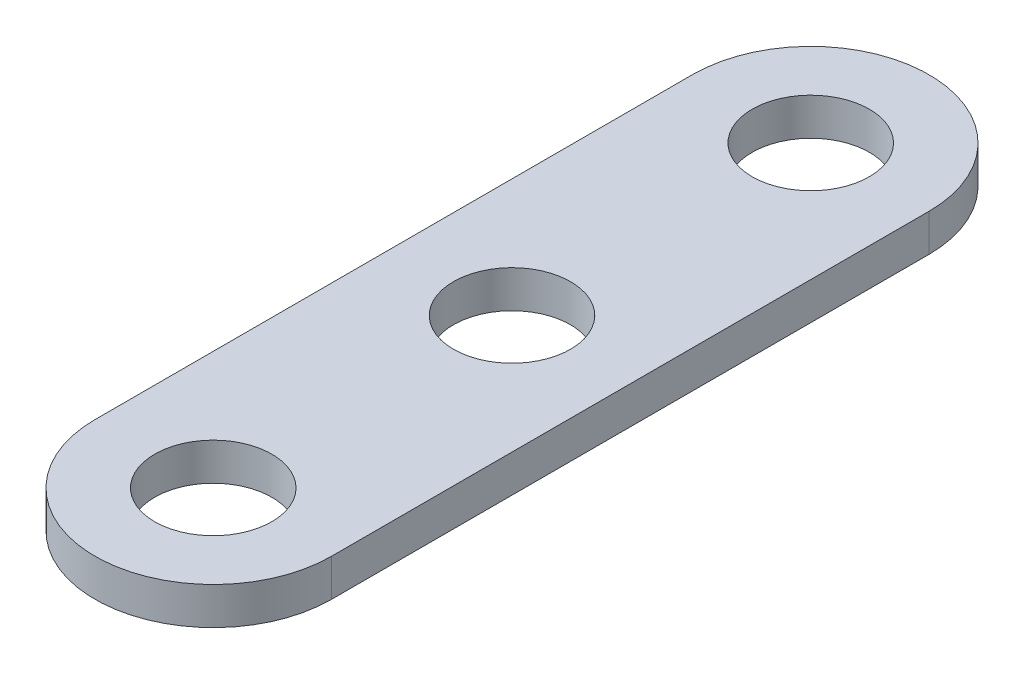
ISO-10303-21;
HEADER;
FILE_DESCRIPTION(('STEP AP214'),'2;1');
FILE_NAME('part.step','',(''),(''),'','','');
FILE_SCHEMA(('AUTOMOTIVE_DESIGN { 1 0 10303 214 1 1 1 1 }'));
ENDSEC;
DATA;
#1=APPLICATION_CONTEXT('core data for automotive mechanical design processes');
#2=APPLICATION_PROTOCOL_DEFINITION('international standard','automotive_design',2000,#1);
#3=PRODUCT_CONTEXT('',#1,'mechanical');
#4=PRODUCT('Part','Part','',(#3));
#5=PRODUCT_RELATED_PRODUCT_CATEGORY('part','',(#4));
#6=PRODUCT_DEFINITION_FORMATION('','',#4);
#7=PRODUCT_DEFINITION_CONTEXT('part definition',#1,'design');
#8=PRODUCT_DEFINITION('design','',#6,#7);
#9=PRODUCT_DEFINITION_SHAPE('','',#8);
#10=(LENGTH_UNIT() NAMED_UNIT(*) SI_UNIT(.MILLI.,.METRE.));
#11=(NAMED_UNIT(*) PLANE_ANGLE_UNIT() SI_UNIT($,.RADIAN.));
#12=(NAMED_UNIT(*) SI_UNIT($,.STERADIAN.) SOLID_ANGLE_UNIT());
#13=UNCERTAINTY_MEASURE_WITH_UNIT(LENGTH_MEASURE(1.E-05),#10,'distance_accuracy_value','');
#14=(GEOMETRIC_REPRESENTATION_CONTEXT(3) GLOBAL_UNCERTAINTY_ASSIGNED_CONTEXT((#13)) GLOBAL_UNIT_ASSIGNED_CONTEXT((#10,
#11,#12)) REPRESENTATION_CONTEXT('',''));
#15=CARTESIAN_POINT('',(0.,0.,0.));
#16=DIRECTION('',(0.,0.,1.));
#17=DIRECTION('',(1.,0.,0.));
#18=AXIS2_PLACEMENT_3D('',#15,#16,#17);
#19=CARTESIAN_POINT('',(0.,1.5875,12.7));
#20=DIRECTION('',(0.,1.,0.));
#21=DIRECTION('',(0.,0.,1.));
#22=AXIS2_PLACEMENT_3D('',#19,#20,#21);
#23=PLANE('',#22);
#24=CARTESIAN_POINT('',(0.,1.5875,-12.7));
#25=DIRECTION('',(0.,1.,0.));
#26=DIRECTION('',(0.,0.,1.));
#27=AXIS2_PLACEMENT_3D('',#24,#25,#26);
#28=CIRCLE('',#27,2.4892);
#29=CARTESIAN_POINT('',(0.,1.5875,-10.2108));
#30=VERTEX_POINT('',#29);
#31=EDGE_CURVE('E119',#30,#30,#28,.T.);
#32=ORIENTED_EDGE('',*,*,#31,.F.);
#33=EDGE_LOOP('',(#32));
#34=FACE_BOUND('',#33,.T.);
#35=CARTESIAN_POINT('',(0.,1.5875,12.7));
#36=DIRECTION('',(0.,1.,0.));
#37=DIRECTION('',(0.,0.,1.));
#38=AXIS2_PLACEMENT_3D('',#35,#36,#37);
#39=CIRCLE('',#38,5.0292);
#40=CARTESIAN_POINT('',(-5.0292,1.5875,12.7));
#41=VERTEX_POINT('',#40);
#42=CARTESIAN_POINT('',(5.0292,1.5875,12.7));
#43=VERTEX_POINT('',#42);
#44=EDGE_CURVE('E89',#41,#43,#39,.T.);
#45=ORIENTED_EDGE('',*,*,#44,.T.);
#46=DIRECTION('',(0.,0.,-1.));
#47=VECTOR('',#46,1.);
#48=CARTESIAN_POINT('',(5.0292,1.5875,12.7));
#49=LINE('',#48,#47);
#50=CARTESIAN_POINT('',(5.02919999999999,1.5875,-12.7));
#51=VERTEX_POINT('',#50);
#52=EDGE_CURVE('E84',#43,#51,#49,.T.);
#53=ORIENTED_EDGE('',*,*,#52,.T.);
#54=CARTESIAN_POINT('',(0.,1.5875,-12.7));
#55=DIRECTION('',(0.,1.,0.));
#56=DIRECTION('',(0.,0.,1.));
#57=AXIS2_PLACEMENT_3D('',#54,#55,#56);
#58=CIRCLE('',#57,5.0292);
#59=CARTESIAN_POINT('',(-5.0292,1.5875,-12.7));
#60=VERTEX_POINT('',#59);
#61=EDGE_CURVE('E87',#51,#60,#58,.T.);
#62=ORIENTED_EDGE('',*,*,#61,.T.);
#63=DIRECTION('',(0.,0.,1.));
#64=VECTOR('',#63,1.);
#65=CARTESIAN_POINT('',(-5.0292,1.5875,-12.7));
#66=LINE('',#65,#64);
#67=EDGE_CURVE('E54',#60,#41,#66,.T.);
#68=ORIENTED_EDGE('',*,*,#67,.T.);
#69=EDGE_LOOP('',(#45,#53,#62,#68));
#70=FACE_BOUND('',#69,.T.);
#71=CARTESIAN_POINT('',(0.,1.5875,0.));
#72=DIRECTION('',(0.,1.,0.));
#73=DIRECTION('',(0.,0.,1.));
#74=AXIS2_PLACEMENT_3D('',#71,#72,#73);
#75=CIRCLE('',#74,2.4892);
#76=CARTESIAN_POINT('',(0.,1.5875,2.4892));
#77=VERTEX_POINT('',#76);
#78=EDGE_CURVE('E104',#77,#77,#75,.T.);
#79=ORIENTED_EDGE('',*,*,#78,.F.);
#80=EDGE_LOOP('',(#79));
#81=FACE_BOUND('',#80,.T.);
#82=CARTESIAN_POINT('',(0.,1.5875,12.7));
#83=DIRECTION('',(0.,1.,0.));
#84=DIRECTION('',(0.,0.,1.));
#85=AXIS2_PLACEMENT_3D('',#82,#83,#84);
#86=CIRCLE('',#85,2.4892);
#87=CARTESIAN_POINT('',(0.,1.5875,15.1892));
#88=VERTEX_POINT('',#87);
#89=EDGE_CURVE('E125',#88,#88,#86,.T.);
#90=ORIENTED_EDGE('',*,*,#89,.F.);
#91=EDGE_LOOP('',(#90));
#92=FACE_BOUND('',#91,.T.);
#93=ADVANCED_FACE('F37',(#34,#70,#81,#92),#23,.T.);
#94=CARTESIAN_POINT('',(0.,0.,12.7));
#95=DIRECTION('',(0.,1.,0.));
#96=DIRECTION('',(0.,0.,1.));
#97=AXIS2_PLACEMENT_3D('',#94,#95,#96);
#98=PLANE('',#97);
#99=CARTESIAN_POINT('',(0.,0.,12.7));
#100=DIRECTION('',(0.,1.,0.));
#101=DIRECTION('',(0.,0.,1.));
#102=AXIS2_PLACEMENT_3D('',#99,#100,#101);
#103=CIRCLE('',#102,5.0292);
#104=CARTESIAN_POINT('',(-5.0292,0.,12.7));
#105=VERTEX_POINT('',#104);
#106=CARTESIAN_POINT('',(5.0292,0.,12.7));
#107=VERTEX_POINT('',#106);
#108=EDGE_CURVE('E101',#105,#107,#103,.T.);
#109=ORIENTED_EDGE('',*,*,#108,.F.);
#110=DIRECTION('',(0.,0.,1.));
#111=VECTOR('',#110,1.);
#112=CARTESIAN_POINT('',(-5.0292,0.,-12.7));
#113=LINE('',#112,#111);
#114=CARTESIAN_POINT('',(-5.0292,0.,-12.7));
#115=VERTEX_POINT('',#114);
#116=EDGE_CURVE('E77',#115,#105,#113,.T.);
#117=ORIENTED_EDGE('',*,*,#116,.F.);
#118=CARTESIAN_POINT('',(0.,0.,-12.7));
#119=DIRECTION('',(0.,1.,0.));
#120=DIRECTION('',(0.,0.,1.));
#121=AXIS2_PLACEMENT_3D('',#118,#119,#120);
#122=CIRCLE('',#121,5.0292);
#123=CARTESIAN_POINT('',(5.02919999999999,0.,-12.7));
#124=VERTEX_POINT('',#123);
#125=EDGE_CURVE('E71',#124,#115,#122,.T.);
#126=ORIENTED_EDGE('',*,*,#125,.F.);
#127=DIRECTION('',(0.,0.,-1.));
#128=VECTOR('',#127,1.);
#129=CARTESIAN_POINT('',(5.0292,0.,12.7));
#130=LINE('',#129,#128);
#131=EDGE_CURVE('E93',#107,#124,#130,.T.);
#132=ORIENTED_EDGE('',*,*,#131,.F.);
#133=EDGE_LOOP('',(#109,#117,#126,#132));
#134=FACE_BOUND('',#133,.T.);
#135=CARTESIAN_POINT('',(0.,0.,0.));
#136=DIRECTION('',(0.,1.,0.));
#137=DIRECTION('',(0.,0.,1.));
#138=AXIS2_PLACEMENT_3D('',#135,#136,#137);
#139=CIRCLE('',#138,2.4892);
#140=CARTESIAN_POINT('',(0.,0.,2.4892));
#141=VERTEX_POINT('',#140);
#142=EDGE_CURVE('E116',#141,#141,#139,.T.);
#143=ORIENTED_EDGE('',*,*,#142,.T.);
#144=EDGE_LOOP('',(#143));
#145=FACE_BOUND('',#144,.T.);
#146=CARTESIAN_POINT('',(0.,0.,-12.7));
#147=DIRECTION('',(0.,1.,0.));
#148=DIRECTION('',(0.,0.,1.));
#149=AXIS2_PLACEMENT_3D('',#146,#147,#148);
#150=CIRCLE('',#149,2.4892);
#151=CARTESIAN_POINT('',(0.,0.,-10.2108));
#152=VERTEX_POINT('',#151);
#153=EDGE_CURVE('E122',#152,#152,#150,.T.);
#154=ORIENTED_EDGE('',*,*,#153,.T.);
#155=EDGE_LOOP('',(#154));
#156=FACE_BOUND('',#155,.T.);
#157=CARTESIAN_POINT('',(0.,0.,12.7));
#158=DIRECTION('',(0.,1.,0.));
#159=DIRECTION('',(0.,0.,1.));
#160=AXIS2_PLACEMENT_3D('',#157,#158,#159);
#161=CIRCLE('',#160,2.4892);
#162=CARTESIAN_POINT('',(0.,0.,15.1892));
#163=VERTEX_POINT('',#162);
#164=EDGE_CURVE('E128',#163,#163,#161,.T.);
#165=ORIENTED_EDGE('',*,*,#164,.T.);
#166=EDGE_LOOP('',(#165));
#167=FACE_BOUND('',#166,.T.);
#168=ADVANCED_FACE('F112',(#134,#145,#156,#167),#98,.F.);
#169=CARTESIAN_POINT('',(0.,1.5875,12.7));
#170=DIRECTION('',(0.,-1.,0.));
#171=DIRECTION('',(0.,0.,-1.));
#172=AXIS2_PLACEMENT_3D('',#169,#170,#171);
#173=CYLINDRICAL_SURFACE('',#172,5.0292);
#174=ORIENTED_EDGE('',*,*,#108,.T.);
#175=DIRECTION('',(0.,-1.,0.));
#176=VECTOR('',#175,1.);
#177=CARTESIAN_POINT('',(5.0292,1.5875,12.7));
#178=LINE('',#177,#176);
#179=EDGE_CURVE('E11',#43,#107,#178,.T.);
#180=ORIENTED_EDGE('',*,*,#179,.F.);
#181=ORIENTED_EDGE('',*,*,#44,.F.);
#182=DIRECTION('',(0.,-1.,0.));
#183=VECTOR('',#182,1.);
#184=CARTESIAN_POINT('',(-5.0292,1.5875,12.7));
#185=LINE('',#184,#183);
#186=EDGE_CURVE('E97',#41,#105,#185,.T.);
#187=ORIENTED_EDGE('',*,*,#186,.T.);
#188=EDGE_LOOP('',(#174,#180,#181,#187));
#189=FACE_BOUND('',#188,.T.);
#190=ADVANCED_FACE('F39',(#189),#173,.T.);
#191=CARTESIAN_POINT('',(5.0292,1.5875,12.7));
#192=DIRECTION('',(-1.,0.,0.));
#193=DIRECTION('',(0.,0.,1.));
#194=AXIS2_PLACEMENT_3D('',#191,#192,#193);
#195=PLANE('',#194);
#196=ORIENTED_EDGE('',*,*,#131,.T.);
#197=DIRECTION('',(0.,-1.,0.));
#198=VECTOR('',#197,1.);
#199=CARTESIAN_POINT('',(5.02919999999999,1.5875,-12.7));
#200=LINE('',#199,#198);
#201=EDGE_CURVE('E46',#51,#124,#200,.T.);
#202=ORIENTED_EDGE('',*,*,#201,.F.);
#203=ORIENTED_EDGE('',*,*,#52,.F.);
#204=ORIENTED_EDGE('',*,*,#179,.T.);
#205=EDGE_LOOP('',(#196,#202,#203,#204));
#206=FACE_BOUND('',#205,.T.);
#207=ADVANCED_FACE('F92',(#206),#195,.F.);
#208=CARTESIAN_POINT('',(0.,1.5875,-12.7));
#209=DIRECTION('',(0.,-1.,0.));
#210=DIRECTION('',(0.,0.,-1.));
#211=AXIS2_PLACEMENT_3D('',#208,#209,#210);
#212=CYLINDRICAL_SURFACE('',#211,5.0292);
#213=ORIENTED_EDGE('',*,*,#125,.T.);
#214=DIRECTION('',(0.,-1.,0.));
#215=VECTOR('',#214,1.);
#216=CARTESIAN_POINT('',(-5.0292,1.5875,-12.7));
#217=LINE('',#216,#215);
#218=EDGE_CURVE('E94',#60,#115,#217,.T.);
#219=ORIENTED_EDGE('',*,*,#218,.F.);
#220=ORIENTED_EDGE('',*,*,#61,.F.);
#221=ORIENTED_EDGE('',*,*,#201,.T.);
#222=EDGE_LOOP('',(#213,#219,#220,#221));
#223=FACE_BOUND('',#222,.T.);
#224=ADVANCED_FACE('F95',(#223),#212,.T.);
#225=CARTESIAN_POINT('',(-5.0292,1.5875,-12.7));
#226=DIRECTION('',(1.,0.,0.));
#227=DIRECTION('',(0.,0.,-1.));
#228=AXIS2_PLACEMENT_3D('',#225,#226,#227);
#229=PLANE('',#228);
#230=ORIENTED_EDGE('',*,*,#116,.T.);
#231=ORIENTED_EDGE('',*,*,#186,.F.);
#232=ORIENTED_EDGE('',*,*,#67,.F.);
#233=ORIENTED_EDGE('',*,*,#218,.T.);
#234=EDGE_LOOP('',(#230,#231,#232,#233));
#235=FACE_BOUND('',#234,.T.);
#236=ADVANCED_FACE('F109',(#235),#229,.F.);
#237=CARTESIAN_POINT('',(0.,1.5875,0.));
#238=DIRECTION('',(0.,-1.,0.));
#239=DIRECTION('',(0.,0.,-1.));
#240=AXIS2_PLACEMENT_3D('',#237,#238,#239);
#241=CYLINDRICAL_SURFACE('',#240,2.4892);
#242=ORIENTED_EDGE('',*,*,#78,.T.);
#243=EDGE_LOOP('',(#242));
#244=FACE_BOUND('',#243,.T.);
#245=ORIENTED_EDGE('',*,*,#142,.F.);
#246=EDGE_LOOP('',(#245));
#247=FACE_BOUND('',#246,.T.);
#248=ADVANCED_FACE('F146',(#244,#247),#241,.F.);
#249=CARTESIAN_POINT('',(0.,1.5875,-12.7));
#250=DIRECTION('',(0.,-1.,0.));
#251=DIRECTION('',(0.,0.,-1.));
#252=AXIS2_PLACEMENT_3D('',#249,#250,#251);
#253=CYLINDRICAL_SURFACE('',#252,2.4892);
#254=ORIENTED_EDGE('',*,*,#31,.T.);
#255=EDGE_LOOP('',(#254));
#256=FACE_BOUND('',#255,.T.);
#257=ORIENTED_EDGE('',*,*,#153,.F.);
#258=EDGE_LOOP('',(#257));
#259=FACE_BOUND('',#258,.T.);
#260=ADVANCED_FACE('F200',(#256,#259),#253,.F.);
#261=CARTESIAN_POINT('',(0.,1.5875,12.7));
#262=DIRECTION('',(0.,-1.,0.));
#263=DIRECTION('',(0.,0.,-1.));
#264=AXIS2_PLACEMENT_3D('',#261,#262,#263);
#265=CYLINDRICAL_SURFACE('',#264,2.4892);
#266=ORIENTED_EDGE('',*,*,#89,.T.);
#267=EDGE_LOOP('',(#266));
#268=FACE_BOUND('',#267,.T.);
#269=ORIENTED_EDGE('',*,*,#164,.F.);
#270=EDGE_LOOP('',(#269));
#271=FACE_BOUND('',#270,.T.);
#272=ADVANCED_FACE('F134',(#268,#271),#265,.F.);
#273=CLOSED_SHELL('',(#93,#168,#190,#207,#224,#236,#248,#260,#272));
#274=MANIFOLD_SOLID_BREP('B2',#273);
#275=ADVANCED_BREP_SHAPE_REPRESENTATION('',(#18,#274),#14);
#276=SHAPE_DEFINITION_REPRESENTATION(#9,#275);
ENDSEC;
END-ISO-10303-21;
